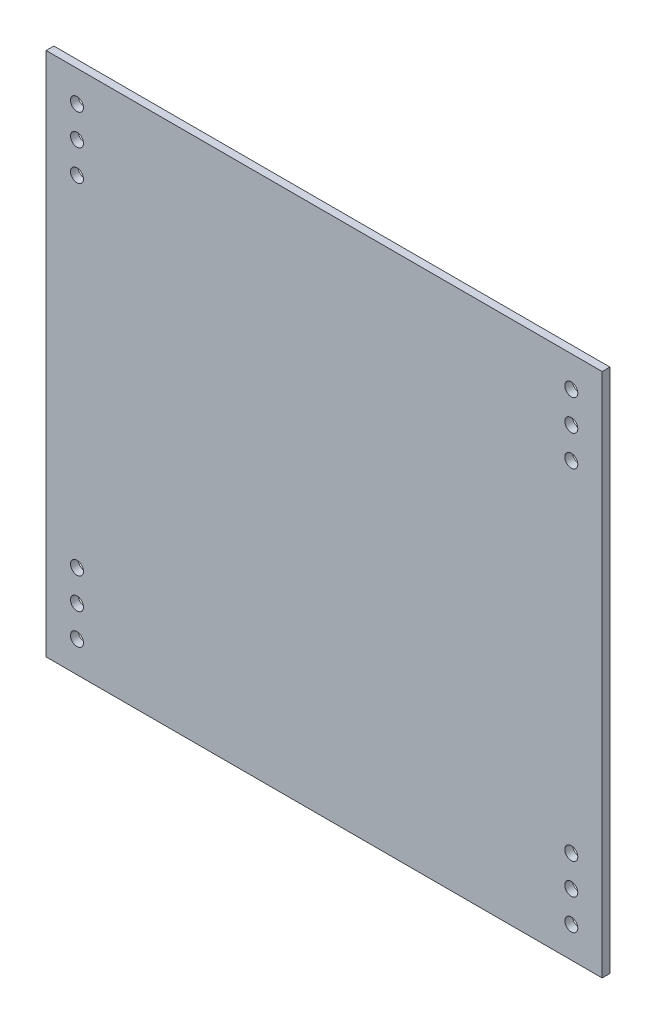
ISO-10303-21;
HEADER;
FILE_DESCRIPTION(('STEP AP214'),'2;1');
FILE_NAME('part.step','',(''),(''),'','','');
FILE_SCHEMA(('AUTOMOTIVE_DESIGN { 1 0 10303 214 1 1 1 1 }'));
ENDSEC;
DATA;
#1=APPLICATION_CONTEXT('core data for automotive mechanical design processes');
#2=APPLICATION_PROTOCOL_DEFINITION('international standard','automotive_design',2000,#1);
#3=PRODUCT_CONTEXT('',#1,'mechanical');
#4=PRODUCT('Part','Part','',(#3));
#5=PRODUCT_RELATED_PRODUCT_CATEGORY('part','',(#4));
#6=PRODUCT_DEFINITION_FORMATION('','',#4);
#7=PRODUCT_DEFINITION_CONTEXT('part definition',#1,'design');
#8=PRODUCT_DEFINITION('design','',#6,#7);
#9=PRODUCT_DEFINITION_SHAPE('','',#8);
#10=(LENGTH_UNIT() NAMED_UNIT(*) SI_UNIT(.MILLI.,.METRE.));
#11=(NAMED_UNIT(*) PLANE_ANGLE_UNIT() SI_UNIT($,.RADIAN.));
#12=(NAMED_UNIT(*) SI_UNIT($,.STERADIAN.) SOLID_ANGLE_UNIT());
#13=UNCERTAINTY_MEASURE_WITH_UNIT(LENGTH_MEASURE(1.E-05),#10,'distance_accuracy_value','');
#14=(GEOMETRIC_REPRESENTATION_CONTEXT(3) GLOBAL_UNCERTAINTY_ASSIGNED_CONTEXT((#13)) GLOBAL_UNIT_ASSIGNED_CONTEXT((#10,
#11,#12)) REPRESENTATION_CONTEXT('',''));
#15=CARTESIAN_POINT('',(0.,0.,0.));
#16=DIRECTION('',(0.,0.,1.));
#17=DIRECTION('',(1.,0.,0.));
#18=AXIS2_PLACEMENT_3D('',#15,#16,#17);
#19=CARTESIAN_POINT('',(114.3,107.95,3.175));
#20=DIRECTION('',(-1.,0.,0.));
#21=DIRECTION('',(0.,-1.,0.));
#22=AXIS2_PLACEMENT_3D('',#19,#20,#21);
#23=PLANE('',#22);
#24=DIRECTION('',(0.,1.,0.));
#25=VECTOR('',#24,1.);
#26=CARTESIAN_POINT('',(114.3,107.95,0.));
#27=LINE('',#26,#25);
#28=CARTESIAN_POINT('',(114.3,-107.95,0.));
#29=VERTEX_POINT('',#28);
#30=CARTESIAN_POINT('',(114.3,107.95,0.));
#31=VERTEX_POINT('',#30);
#32=EDGE_CURVE('E113',#29,#31,#27,.T.);
#33=ORIENTED_EDGE('',*,*,#32,.T.);
#34=DIRECTION('',(0.,0.,-1.));
#35=VECTOR('',#34,1.);
#36=CARTESIAN_POINT('',(114.3,107.95,3.175));
#37=LINE('',#36,#35);
#38=CARTESIAN_POINT('',(114.3,107.95,3.175));
#39=VERTEX_POINT('',#38);
#40=EDGE_CURVE('E11',#39,#31,#37,.T.);
#41=ORIENTED_EDGE('',*,*,#40,.F.);
#42=DIRECTION('',(0.,1.,0.));
#43=VECTOR('',#42,1.);
#44=CARTESIAN_POINT('',(114.3,107.95,3.175));
#45=LINE('',#44,#43);
#46=CARTESIAN_POINT('',(114.3,-107.95,3.175));
#47=VERTEX_POINT('',#46);
#48=EDGE_CURVE('E97',#47,#39,#45,.T.);
#49=ORIENTED_EDGE('',*,*,#48,.F.);
#50=DIRECTION('',(0.,0.,-1.));
#51=VECTOR('',#50,1.);
#52=CARTESIAN_POINT('',(114.3,-107.95,3.175));
#53=LINE('',#52,#51);
#54=EDGE_CURVE('E109',#47,#29,#53,.T.);
#55=ORIENTED_EDGE('',*,*,#54,.T.);
#56=EDGE_LOOP('',(#33,#41,#49,#55));
#57=FACE_BOUND('',#56,.T.);
#58=ADVANCED_FACE('F45',(#57),#23,.F.);
#59=CARTESIAN_POINT('',(-114.3,107.95,3.175));
#60=DIRECTION('',(0.,-1.,0.));
#61=DIRECTION('',(1.,0.,0.));
#62=AXIS2_PLACEMENT_3D('',#59,#60,#61);
#63=PLANE('',#62);
#64=DIRECTION('',(-1.,0.,0.));
#65=VECTOR('',#64,1.);
#66=CARTESIAN_POINT('',(-114.3,107.95,0.));
#67=LINE('',#66,#65);
#68=CARTESIAN_POINT('',(-114.3,107.95,0.));
#69=VERTEX_POINT('',#68);
#70=EDGE_CURVE('E102',#31,#69,#67,.T.);
#71=ORIENTED_EDGE('',*,*,#70,.T.);
#72=DIRECTION('',(0.,0.,-1.));
#73=VECTOR('',#72,1.);
#74=CARTESIAN_POINT('',(-114.3,107.95,3.175));
#75=LINE('',#74,#73);
#76=CARTESIAN_POINT('',(-114.3,107.95,3.175));
#77=VERTEX_POINT('',#76);
#78=EDGE_CURVE('E54',#77,#69,#75,.T.);
#79=ORIENTED_EDGE('',*,*,#78,.F.);
#80=DIRECTION('',(-1.,0.,0.));
#81=VECTOR('',#80,1.);
#82=CARTESIAN_POINT('',(-114.3,107.95,3.175));
#83=LINE('',#82,#81);
#84=EDGE_CURVE('E92',#39,#77,#83,.T.);
#85=ORIENTED_EDGE('',*,*,#84,.F.);
#86=ORIENTED_EDGE('',*,*,#40,.T.);
#87=EDGE_LOOP('',(#71,#79,#85,#86));
#88=FACE_BOUND('',#87,.T.);
#89=ADVANCED_FACE('F101',(#88),#63,.F.);
#90=CARTESIAN_POINT('',(-114.3,107.95,3.175));
#91=DIRECTION('',(1.,0.,0.));
#92=DIRECTION('',(0.,1.,0.));
#93=AXIS2_PLACEMENT_3D('',#90,#91,#92);
#94=PLANE('',#93);
#95=DIRECTION('',(0.,-1.,0.));
#96=VECTOR('',#95,1.);
#97=CARTESIAN_POINT('',(-114.3,107.95,0.));
#98=LINE('',#97,#96);
#99=CARTESIAN_POINT('',(-114.3,-107.95,0.));
#100=VERTEX_POINT('',#99);
#101=EDGE_CURVE('E79',#69,#100,#98,.T.);
#102=ORIENTED_EDGE('',*,*,#101,.T.);
#103=DIRECTION('',(0.,0.,-1.));
#104=VECTOR('',#103,1.);
#105=CARTESIAN_POINT('',(-114.3,-107.95,3.175));
#106=LINE('',#105,#104);
#107=CARTESIAN_POINT('',(-114.3,-107.95,3.175));
#108=VERTEX_POINT('',#107);
#109=EDGE_CURVE('E104',#108,#100,#106,.T.);
#110=ORIENTED_EDGE('',*,*,#109,.F.);
#111=DIRECTION('',(0.,-1.,0.));
#112=VECTOR('',#111,1.);
#113=CARTESIAN_POINT('',(-114.3,107.95,3.175));
#114=LINE('',#113,#112);
#115=EDGE_CURVE('E95',#77,#108,#114,.T.);
#116=ORIENTED_EDGE('',*,*,#115,.F.);
#117=ORIENTED_EDGE('',*,*,#78,.T.);
#118=EDGE_LOOP('',(#102,#110,#116,#117));
#119=FACE_BOUND('',#118,.T.);
#120=ADVANCED_FACE('F105',(#119),#94,.F.);
#121=CARTESIAN_POINT('',(-114.3,-107.95,3.175));
#122=DIRECTION('',(0.,1.,0.));
#123=DIRECTION('',(0.,0.,1.));
#124=AXIS2_PLACEMENT_3D('',#121,#122,#123);
#125=PLANE('',#124);
#126=DIRECTION('',(1.,0.,0.));
#127=VECTOR('',#126,1.);
#128=CARTESIAN_POINT('',(-114.3,-107.95,0.));
#129=LINE('',#128,#127);
#130=EDGE_CURVE('E85',#100,#29,#129,.T.);
#131=ORIENTED_EDGE('',*,*,#130,.T.);
#132=ORIENTED_EDGE('',*,*,#54,.F.);
#133=DIRECTION('',(1.,0.,0.));
#134=VECTOR('',#133,1.);
#135=CARTESIAN_POINT('',(-114.3,-107.95,3.175));
#136=LINE('',#135,#134);
#137=EDGE_CURVE('E62',#108,#47,#136,.T.);
#138=ORIENTED_EDGE('',*,*,#137,.F.);
#139=ORIENTED_EDGE('',*,*,#109,.T.);
#140=EDGE_LOOP('',(#131,#132,#138,#139));
#141=FACE_BOUND('',#140,.T.);
#142=ADVANCED_FACE('F127',(#141),#125,.F.);
#143=CARTESIAN_POINT('',(0.,0.,3.175));
#144=DIRECTION('',(0.,0.,1.));
#145=DIRECTION('',(1.,0.,0.));
#146=AXIS2_PLACEMENT_3D('',#143,#144,#145);
#147=PLANE('',#146);
#148=CARTESIAN_POINT('',(-101.6,69.85,3.175));
#149=DIRECTION('',(0.,0.,1.));
#150=DIRECTION('',(-1.,0.,0.));
#151=AXIS2_PLACEMENT_3D('',#148,#149,#150);
#152=CIRCLE('',#151,2.667);
#153=CARTESIAN_POINT('',(-104.267,69.85,3.175));
#154=VERTEX_POINT('',#153);
#155=EDGE_CURVE('E147',#154,#154,#152,.T.);
#156=ORIENTED_EDGE('',*,*,#155,.F.);
#157=EDGE_LOOP('',(#156));
#158=FACE_BOUND('',#157,.T.);
#159=CARTESIAN_POINT('',(101.6,95.25,3.175));
#160=DIRECTION('',(0.,0.,1.));
#161=DIRECTION('',(1.,0.,0.));
#162=AXIS2_PLACEMENT_3D('',#159,#160,#161);
#163=CIRCLE('',#162,2.66699999999999);
#164=CARTESIAN_POINT('',(104.267,95.25,3.175));
#165=VERTEX_POINT('',#164);
#166=EDGE_CURVE('E178',#165,#165,#163,.T.);
#167=ORIENTED_EDGE('',*,*,#166,.F.);
#168=EDGE_LOOP('',(#167));
#169=FACE_BOUND('',#168,.T.);
#170=CARTESIAN_POINT('',(101.6,82.55,3.175));
#171=DIRECTION('',(0.,0.,1.));
#172=DIRECTION('',(1.,0.,0.));
#173=AXIS2_PLACEMENT_3D('',#170,#171,#172);
#174=CIRCLE('',#173,2.667);
#175=CARTESIAN_POINT('',(104.267,82.55,3.175));
#176=VERTEX_POINT('',#175);
#177=EDGE_CURVE('E179',#176,#176,#174,.T.);
#178=ORIENTED_EDGE('',*,*,#177,.F.);
#179=EDGE_LOOP('',(#178));
#180=FACE_BOUND('',#179,.T.);
#181=CARTESIAN_POINT('',(101.6,69.85,3.175));
#182=DIRECTION('',(0.,0.,1.));
#183=DIRECTION('',(1.,0.,0.));
#184=AXIS2_PLACEMENT_3D('',#181,#182,#183);
#185=CIRCLE('',#184,2.667);
#186=CARTESIAN_POINT('',(104.267,69.85,3.175));
#187=VERTEX_POINT('',#186);
#188=EDGE_CURVE('E194',#187,#187,#185,.T.);
#189=ORIENTED_EDGE('',*,*,#188,.F.);
#190=EDGE_LOOP('',(#189));
#191=FACE_BOUND('',#190,.T.);
#192=CARTESIAN_POINT('',(-101.6,82.55,3.175));
#193=DIRECTION('',(0.,0.,1.));
#194=DIRECTION('',(-1.,0.,0.));
#195=AXIS2_PLACEMENT_3D('',#192,#193,#194);
#196=CIRCLE('',#195,2.667);
#197=CARTESIAN_POINT('',(-104.267,82.55,3.175));
#198=VERTEX_POINT('',#197);
#199=EDGE_CURVE('E146',#198,#198,#196,.T.);
#200=ORIENTED_EDGE('',*,*,#199,.F.);
#201=EDGE_LOOP('',(#200));
#202=FACE_BOUND('',#201,.T.);
#203=CARTESIAN_POINT('',(-101.6,95.25,3.175));
#204=DIRECTION('',(0.,0.,1.));
#205=DIRECTION('',(-1.,0.,0.));
#206=AXIS2_PLACEMENT_3D('',#203,#204,#205);
#207=CIRCLE('',#206,2.66699999999999);
#208=CARTESIAN_POINT('',(-104.267,95.25,3.175));
#209=VERTEX_POINT('',#208);
#210=EDGE_CURVE('E155',#209,#209,#207,.T.);
#211=ORIENTED_EDGE('',*,*,#210,.F.);
#212=EDGE_LOOP('',(#211));
#213=FACE_BOUND('',#212,.T.);
#214=CARTESIAN_POINT('',(-101.6,-95.25,3.175));
#215=DIRECTION('',(0.,0.,1.));
#216=DIRECTION('',(1.,0.,0.));
#217=AXIS2_PLACEMENT_3D('',#214,#215,#216);
#218=CIRCLE('',#217,2.66699999999999);
#219=CARTESIAN_POINT('',(-98.933,-95.25,3.175));
#220=VERTEX_POINT('',#219);
#221=EDGE_CURVE('E163',#220,#220,#218,.T.);
#222=ORIENTED_EDGE('',*,*,#221,.F.);
#223=EDGE_LOOP('',(#222));
#224=FACE_BOUND('',#223,.T.);
#225=CARTESIAN_POINT('',(-101.6,-82.55,3.175));
#226=DIRECTION('',(0.,0.,1.));
#227=DIRECTION('',(1.,0.,0.));
#228=AXIS2_PLACEMENT_3D('',#225,#226,#227);
#229=CIRCLE('',#228,2.667);
#230=CARTESIAN_POINT('',(-98.933,-82.55,3.175));
#231=VERTEX_POINT('',#230);
#232=EDGE_CURVE('E138',#231,#231,#229,.T.);
#233=ORIENTED_EDGE('',*,*,#232,.F.);
#234=EDGE_LOOP('',(#233));
#235=FACE_BOUND('',#234,.T.);
#236=CARTESIAN_POINT('',(101.6,-95.2499999999999,3.175));
#237=DIRECTION('',(0.,0.,1.));
#238=DIRECTION('',(-1.,0.,0.));
#239=AXIS2_PLACEMENT_3D('',#236,#237,#238);
#240=CIRCLE('',#239,2.66699999999999);
#241=CARTESIAN_POINT('',(98.933,-95.2499999999999,3.175));
#242=VERTEX_POINT('',#241);
#243=EDGE_CURVE('E195',#242,#242,#240,.T.);
#244=ORIENTED_EDGE('',*,*,#243,.F.);
#245=EDGE_LOOP('',(#244));
#246=FACE_BOUND('',#245,.T.);
#247=CARTESIAN_POINT('',(101.6,-82.5499999999999,3.175));
#248=DIRECTION('',(0.,0.,1.));
#249=DIRECTION('',(-1.,0.,0.));
#250=AXIS2_PLACEMENT_3D('',#247,#248,#249);
#251=CIRCLE('',#250,2.667);
#252=CARTESIAN_POINT('',(98.933,-82.5499999999999,3.175));
#253=VERTEX_POINT('',#252);
#254=EDGE_CURVE('E218',#253,#253,#251,.T.);
#255=ORIENTED_EDGE('',*,*,#254,.F.);
#256=EDGE_LOOP('',(#255));
#257=FACE_BOUND('',#256,.T.);
#258=CARTESIAN_POINT('',(101.6,-69.8499999999999,3.175));
#259=DIRECTION('',(0.,0.,1.));
#260=DIRECTION('',(-1.,0.,0.));
#261=AXIS2_PLACEMENT_3D('',#258,#259,#260);
#262=CIRCLE('',#261,2.667);
#263=CARTESIAN_POINT('',(98.933,-69.8499999999999,3.175));
#264=VERTEX_POINT('',#263);
#265=EDGE_CURVE('E210',#264,#264,#262,.T.);
#266=ORIENTED_EDGE('',*,*,#265,.F.);
#267=EDGE_LOOP('',(#266));
#268=FACE_BOUND('',#267,.T.);
#269=CARTESIAN_POINT('',(-101.6,-69.85,3.175));
#270=DIRECTION('',(0.,0.,1.));
#271=DIRECTION('',(1.,0.,0.));
#272=AXIS2_PLACEMENT_3D('',#269,#270,#271);
#273=CIRCLE('',#272,2.667);
#274=CARTESIAN_POINT('',(-98.933,-69.85,3.175));
#275=VERTEX_POINT('',#274);
#276=EDGE_CURVE('E134',#275,#275,#273,.T.);
#277=ORIENTED_EDGE('',*,*,#276,.F.);
#278=EDGE_LOOP('',(#277));
#279=FACE_BOUND('',#278,.T.);
#280=ORIENTED_EDGE('',*,*,#48,.T.);
#281=ORIENTED_EDGE('',*,*,#84,.T.);
#282=ORIENTED_EDGE('',*,*,#115,.T.);
#283=ORIENTED_EDGE('',*,*,#137,.T.);
#284=EDGE_LOOP('',(#280,#281,#282,#283));
#285=FACE_BOUND('',#284,.T.);
#286=ADVANCED_FACE('F93',(#158,#169,#180,#191,#202,#213,#224,#235,#246,#257,#268,#279,#285),
#147,.T.);
#287=CARTESIAN_POINT('',(0.,0.,0.));
#288=DIRECTION('',(0.,0.,1.));
#289=DIRECTION('',(1.,0.,0.));
#290=AXIS2_PLACEMENT_3D('',#287,#288,#289);
#291=PLANE('',#290);
#292=CARTESIAN_POINT('',(-101.6,69.85,0.));
#293=DIRECTION('',(0.,0.,1.));
#294=DIRECTION('',(-1.,0.,0.));
#295=AXIS2_PLACEMENT_3D('',#292,#293,#294);
#296=CIRCLE('',#295,2.667);
#297=CARTESIAN_POINT('',(-104.267,69.85,0.));
#298=VERTEX_POINT('',#297);
#299=EDGE_CURVE('E183',#298,#298,#296,.T.);
#300=ORIENTED_EDGE('',*,*,#299,.T.);
#301=EDGE_LOOP('',(#300));
#302=FACE_BOUND('',#301,.T.);
#303=CARTESIAN_POINT('',(101.6,95.25,0.));
#304=DIRECTION('',(0.,0.,1.));
#305=DIRECTION('',(1.,0.,0.));
#306=AXIS2_PLACEMENT_3D('',#303,#304,#305);
#307=CIRCLE('',#306,2.66699999999999);
#308=CARTESIAN_POINT('',(104.267,95.25,0.));
#309=VERTEX_POINT('',#308);
#310=EDGE_CURVE('E174',#309,#309,#307,.T.);
#311=ORIENTED_EDGE('',*,*,#310,.T.);
#312=EDGE_LOOP('',(#311));
#313=FACE_BOUND('',#312,.T.);
#314=CARTESIAN_POINT('',(101.6,82.55,0.));
#315=DIRECTION('',(0.,0.,1.));
#316=DIRECTION('',(1.,0.,0.));
#317=AXIS2_PLACEMENT_3D('',#314,#315,#316);
#318=CIRCLE('',#317,2.667);
#319=CARTESIAN_POINT('',(104.267,82.55,0.));
#320=VERTEX_POINT('',#319);
#321=EDGE_CURVE('E199',#320,#320,#318,.T.);
#322=ORIENTED_EDGE('',*,*,#321,.T.);
#323=EDGE_LOOP('',(#322));
#324=FACE_BOUND('',#323,.T.);
#325=CARTESIAN_POINT('',(101.6,69.85,0.));
#326=DIRECTION('',(0.,0.,1.));
#327=DIRECTION('',(1.,0.,0.));
#328=AXIS2_PLACEMENT_3D('',#325,#326,#327);
#329=CIRCLE('',#328,2.667);
#330=CARTESIAN_POINT('',(104.267,69.85,0.));
#331=VERTEX_POINT('',#330);
#332=EDGE_CURVE('E190',#331,#331,#329,.T.);
#333=ORIENTED_EDGE('',*,*,#332,.T.);
#334=EDGE_LOOP('',(#333));
#335=FACE_BOUND('',#334,.T.);
#336=CARTESIAN_POINT('',(-101.6,82.55,0.));
#337=DIRECTION('',(0.,0.,1.));
#338=DIRECTION('',(-1.,0.,0.));
#339=AXIS2_PLACEMENT_3D('',#336,#337,#338);
#340=CIRCLE('',#339,2.667);
#341=CARTESIAN_POINT('',(-104.267,82.55,0.));
#342=VERTEX_POINT('',#341);
#343=EDGE_CURVE('E142',#342,#342,#340,.T.);
#344=ORIENTED_EDGE('',*,*,#343,.T.);
#345=EDGE_LOOP('',(#344));
#346=FACE_BOUND('',#345,.T.);
#347=CARTESIAN_POINT('',(-101.6,95.25,0.));
#348=DIRECTION('',(0.,0.,1.));
#349=DIRECTION('',(-1.,0.,0.));
#350=AXIS2_PLACEMENT_3D('',#347,#348,#349);
#351=CIRCLE('',#350,2.66699999999999);
#352=CARTESIAN_POINT('',(-104.267,95.25,0.));
#353=VERTEX_POINT('',#352);
#354=EDGE_CURVE('E151',#353,#353,#351,.T.);
#355=ORIENTED_EDGE('',*,*,#354,.T.);
#356=EDGE_LOOP('',(#355));
#357=FACE_BOUND('',#356,.T.);
#358=CARTESIAN_POINT('',(-101.6,-95.25,0.));
#359=DIRECTION('',(0.,0.,1.));
#360=DIRECTION('',(1.,0.,0.));
#361=AXIS2_PLACEMENT_3D('',#358,#359,#360);
#362=CIRCLE('',#361,2.66699999999999);
#363=CARTESIAN_POINT('',(-98.933,-95.25,0.));
#364=VERTEX_POINT('',#363);
#365=EDGE_CURVE('E159',#364,#364,#362,.T.);
#366=ORIENTED_EDGE('',*,*,#365,.T.);
#367=EDGE_LOOP('',(#366));
#368=FACE_BOUND('',#367,.T.);
#369=CARTESIAN_POINT('',(-101.6,-82.55,0.));
#370=DIRECTION('',(0.,0.,1.));
#371=DIRECTION('',(1.,0.,0.));
#372=AXIS2_PLACEMENT_3D('',#369,#370,#371);
#373=CIRCLE('',#372,2.667);
#374=CARTESIAN_POINT('',(-98.933,-82.55,0.));
#375=VERTEX_POINT('',#374);
#376=EDGE_CURVE('E167',#375,#375,#373,.T.);
#377=ORIENTED_EDGE('',*,*,#376,.T.);
#378=EDGE_LOOP('',(#377));
#379=FACE_BOUND('',#378,.T.);
#380=CARTESIAN_POINT('',(101.6,-95.2499999999999,0.));
#381=DIRECTION('',(0.,0.,1.));
#382=DIRECTION('',(-1.,0.,0.));
#383=AXIS2_PLACEMENT_3D('',#380,#381,#382);
#384=CIRCLE('',#383,2.66699999999999);
#385=CARTESIAN_POINT('',(98.933,-95.2499999999999,0.));
#386=VERTEX_POINT('',#385);
#387=EDGE_CURVE('E222',#386,#386,#384,.T.);
#388=ORIENTED_EDGE('',*,*,#387,.T.);
#389=EDGE_LOOP('',(#388));
#390=FACE_BOUND('',#389,.T.);
#391=CARTESIAN_POINT('',(101.6,-82.5499999999999,0.));
#392=DIRECTION('',(0.,0.,1.));
#393=DIRECTION('',(-1.,0.,0.));
#394=AXIS2_PLACEMENT_3D('',#391,#392,#393);
#395=CIRCLE('',#394,2.667);
#396=CARTESIAN_POINT('',(98.933,-82.5499999999999,0.));
#397=VERTEX_POINT('',#396);
#398=EDGE_CURVE('E214',#397,#397,#395,.T.);
#399=ORIENTED_EDGE('',*,*,#398,.T.);
#400=EDGE_LOOP('',(#399));
#401=FACE_BOUND('',#400,.T.);
#402=CARTESIAN_POINT('',(101.6,-69.8499999999999,0.));
#403=DIRECTION('',(0.,0.,1.));
#404=DIRECTION('',(-1.,0.,0.));
#405=AXIS2_PLACEMENT_3D('',#402,#403,#404);
#406=CIRCLE('',#405,2.667);
#407=CARTESIAN_POINT('',(98.933,-69.8499999999999,0.));
#408=VERTEX_POINT('',#407);
#409=EDGE_CURVE('E206',#408,#408,#406,.T.);
#410=ORIENTED_EDGE('',*,*,#409,.T.);
#411=EDGE_LOOP('',(#410));
#412=FACE_BOUND('',#411,.T.);
#413=CARTESIAN_POINT('',(-101.6,-69.85,0.));
#414=DIRECTION('',(0.,0.,1.));
#415=DIRECTION('',(1.,0.,0.));
#416=AXIS2_PLACEMENT_3D('',#413,#414,#415);
#417=CIRCLE('',#416,2.667);
#418=CARTESIAN_POINT('',(-98.933,-69.85,0.));
#419=VERTEX_POINT('',#418);
#420=EDGE_CURVE('E117',#419,#419,#417,.T.);
#421=ORIENTED_EDGE('',*,*,#420,.T.);
#422=EDGE_LOOP('',(#421));
#423=FACE_BOUND('',#422,.T.);
#424=ORIENTED_EDGE('',*,*,#32,.F.);
#425=ORIENTED_EDGE('',*,*,#130,.F.);
#426=ORIENTED_EDGE('',*,*,#101,.F.);
#427=ORIENTED_EDGE('',*,*,#70,.F.);
#428=EDGE_LOOP('',(#424,#425,#426,#427));
#429=FACE_BOUND('',#428,.T.);
#430=ADVANCED_FACE('F130',(#302,#313,#324,#335,#346,#357,#368,#379,#390,#401,#412,#423,#429),
#291,.F.);
#431=CARTESIAN_POINT('',(-101.6,-69.85,0.));
#432=DIRECTION('',(0.,0.,1.));
#433=DIRECTION('',(1.,0.,0.));
#434=AXIS2_PLACEMENT_3D('',#431,#432,#433);
#435=CYLINDRICAL_SURFACE('',#434,2.667);
#436=ORIENTED_EDGE('',*,*,#420,.F.);
#437=EDGE_LOOP('',(#436));
#438=FACE_BOUND('',#437,.T.);
#439=ORIENTED_EDGE('',*,*,#276,.T.);
#440=EDGE_LOOP('',(#439));
#441=FACE_BOUND('',#440,.T.);
#442=ADVANCED_FACE('F242',(#438,#441),#435,.F.);
#443=CARTESIAN_POINT('',(101.6,-69.8499999999999,0.));
#444=DIRECTION('',(0.,0.,1.));
#445=DIRECTION('',(1.,0.,0.));
#446=AXIS2_PLACEMENT_3D('',#443,#444,#445);
#447=CYLINDRICAL_SURFACE('',#446,2.667);
#448=ORIENTED_EDGE('',*,*,#409,.F.);
#449=EDGE_LOOP('',(#448));
#450=FACE_BOUND('',#449,.T.);
#451=ORIENTED_EDGE('',*,*,#265,.T.);
#452=EDGE_LOOP('',(#451));
#453=FACE_BOUND('',#452,.T.);
#454=ADVANCED_FACE('F244',(#450,#453),#447,.F.);
#455=CARTESIAN_POINT('',(101.6,-82.5499999999999,0.));
#456=DIRECTION('',(0.,0.,1.));
#457=DIRECTION('',(1.,0.,0.));
#458=AXIS2_PLACEMENT_3D('',#455,#456,#457);
#459=CYLINDRICAL_SURFACE('',#458,2.667);
#460=ORIENTED_EDGE('',*,*,#398,.F.);
#461=EDGE_LOOP('',(#460));
#462=FACE_BOUND('',#461,.T.);
#463=ORIENTED_EDGE('',*,*,#254,.T.);
#464=EDGE_LOOP('',(#463));
#465=FACE_BOUND('',#464,.T.);
#466=ADVANCED_FACE('F251',(#462,#465),#459,.F.);
#467=CARTESIAN_POINT('',(101.6,-95.2499999999999,0.));
#468=DIRECTION('',(0.,0.,1.));
#469=DIRECTION('',(1.,0.,0.));
#470=AXIS2_PLACEMENT_3D('',#467,#468,#469);
#471=CYLINDRICAL_SURFACE('',#470,2.66699999999999);
#472=ORIENTED_EDGE('',*,*,#387,.F.);
#473=EDGE_LOOP('',(#472));
#474=FACE_BOUND('',#473,.T.);
#475=ORIENTED_EDGE('',*,*,#243,.T.);
#476=EDGE_LOOP('',(#475));
#477=FACE_BOUND('',#476,.T.);
#478=ADVANCED_FACE('F230',(#474,#477),#471,.F.);
#479=CARTESIAN_POINT('',(-101.6,-82.55,0.));
#480=DIRECTION('',(0.,0.,1.));
#481=DIRECTION('',(1.,0.,0.));
#482=AXIS2_PLACEMENT_3D('',#479,#480,#481);
#483=CYLINDRICAL_SURFACE('',#482,2.667);
#484=ORIENTED_EDGE('',*,*,#376,.F.);
#485=EDGE_LOOP('',(#484));
#486=FACE_BOUND('',#485,.T.);
#487=ORIENTED_EDGE('',*,*,#232,.T.);
#488=EDGE_LOOP('',(#487));
#489=FACE_BOUND('',#488,.T.);
#490=ADVANCED_FACE('F311',(#486,#489),#483,.F.);
#491=CARTESIAN_POINT('',(-101.6,-95.25,0.));
#492=DIRECTION('',(0.,0.,1.));
#493=DIRECTION('',(1.,0.,0.));
#494=AXIS2_PLACEMENT_3D('',#491,#492,#493);
#495=CYLINDRICAL_SURFACE('',#494,2.66699999999999);
#496=ORIENTED_EDGE('',*,*,#365,.F.);
#497=EDGE_LOOP('',(#496));
#498=FACE_BOUND('',#497,.T.);
#499=ORIENTED_EDGE('',*,*,#221,.T.);
#500=EDGE_LOOP('',(#499));
#501=FACE_BOUND('',#500,.T.);
#502=ADVANCED_FACE('F321',(#498,#501),#495,.F.);
#503=CARTESIAN_POINT('',(-101.6,95.25,0.));
#504=DIRECTION('',(0.,0.,1.));
#505=DIRECTION('',(1.,0.,0.));
#506=AXIS2_PLACEMENT_3D('',#503,#504,#505);
#507=CYLINDRICAL_SURFACE('',#506,2.66699999999999);
#508=ORIENTED_EDGE('',*,*,#354,.F.);
#509=EDGE_LOOP('',(#508));
#510=FACE_BOUND('',#509,.T.);
#511=ORIENTED_EDGE('',*,*,#210,.T.);
#512=EDGE_LOOP('',(#511));
#513=FACE_BOUND('',#512,.T.);
#514=ADVANCED_FACE('F331',(#510,#513),#507,.F.);
#515=CARTESIAN_POINT('',(-101.6,82.55,0.));
#516=DIRECTION('',(0.,0.,1.));
#517=DIRECTION('',(1.,0.,0.));
#518=AXIS2_PLACEMENT_3D('',#515,#516,#517);
#519=CYLINDRICAL_SURFACE('',#518,2.667);
#520=ORIENTED_EDGE('',*,*,#343,.F.);
#521=EDGE_LOOP('',(#520));
#522=FACE_BOUND('',#521,.T.);
#523=ORIENTED_EDGE('',*,*,#199,.T.);
#524=EDGE_LOOP('',(#523));
#525=FACE_BOUND('',#524,.T.);
#526=ADVANCED_FACE('F341',(#522,#525),#519,.F.);
#527=CARTESIAN_POINT('',(101.6,69.85,0.));
#528=DIRECTION('',(0.,0.,1.));
#529=DIRECTION('',(1.,0.,0.));
#530=AXIS2_PLACEMENT_3D('',#527,#528,#529);
#531=CYLINDRICAL_SURFACE('',#530,2.667);
#532=ORIENTED_EDGE('',*,*,#332,.F.);
#533=EDGE_LOOP('',(#532));
#534=FACE_BOUND('',#533,.T.);
#535=ORIENTED_EDGE('',*,*,#188,.T.);
#536=EDGE_LOOP('',(#535));
#537=FACE_BOUND('',#536,.T.);
#538=ADVANCED_FACE('F351',(#534,#537),#531,.F.);
#539=CARTESIAN_POINT('',(101.6,82.55,0.));
#540=DIRECTION('',(0.,0.,1.));
#541=DIRECTION('',(1.,0.,0.));
#542=AXIS2_PLACEMENT_3D('',#539,#540,#541);
#543=CYLINDRICAL_SURFACE('',#542,2.667);
#544=ORIENTED_EDGE('',*,*,#321,.F.);
#545=EDGE_LOOP('',(#544));
#546=FACE_BOUND('',#545,.T.);
#547=ORIENTED_EDGE('',*,*,#177,.T.);
#548=EDGE_LOOP('',(#547));
#549=FACE_BOUND('',#548,.T.);
#550=ADVANCED_FACE('F360',(#546,#549),#543,.F.);
#551=CARTESIAN_POINT('',(101.6,95.25,0.));
#552=DIRECTION('',(0.,0.,1.));
#553=DIRECTION('',(1.,0.,0.));
#554=AXIS2_PLACEMENT_3D('',#551,#552,#553);
#555=CYLINDRICAL_SURFACE('',#554,2.66699999999999);
#556=ORIENTED_EDGE('',*,*,#310,.F.);
#557=EDGE_LOOP('',(#556));
#558=FACE_BOUND('',#557,.T.);
#559=ORIENTED_EDGE('',*,*,#166,.T.);
#560=EDGE_LOOP('',(#559));
#561=FACE_BOUND('',#560,.T.);
#562=ADVANCED_FACE('F370',(#558,#561),#555,.F.);
#563=CARTESIAN_POINT('',(-101.6,69.85,0.));
#564=DIRECTION('',(0.,0.,1.));
#565=DIRECTION('',(1.,0.,0.));
#566=AXIS2_PLACEMENT_3D('',#563,#564,#565);
#567=CYLINDRICAL_SURFACE('',#566,2.667);
#568=ORIENTED_EDGE('',*,*,#299,.F.);
#569=EDGE_LOOP('',(#568));
#570=FACE_BOUND('',#569,.T.);
#571=ORIENTED_EDGE('',*,*,#155,.T.);
#572=EDGE_LOOP('',(#571));
#573=FACE_BOUND('',#572,.T.);
#574=ADVANCED_FACE('F380',(#570,#573),#567,.F.);
#575=CLOSED_SHELL('',(#58,#89,#120,#142,#286,#430,#442,#454,#466,#478,#490,#502,#514,#526,#538,
#550,#562,#574));
#576=MANIFOLD_SOLID_BREP('B2',#575);
#577=ADVANCED_BREP_SHAPE_REPRESENTATION('',(#18,#576),#14);
#578=SHAPE_DEFINITION_REPRESENTATION(#9,#577);
ENDSEC;
END-ISO-10303-21;
